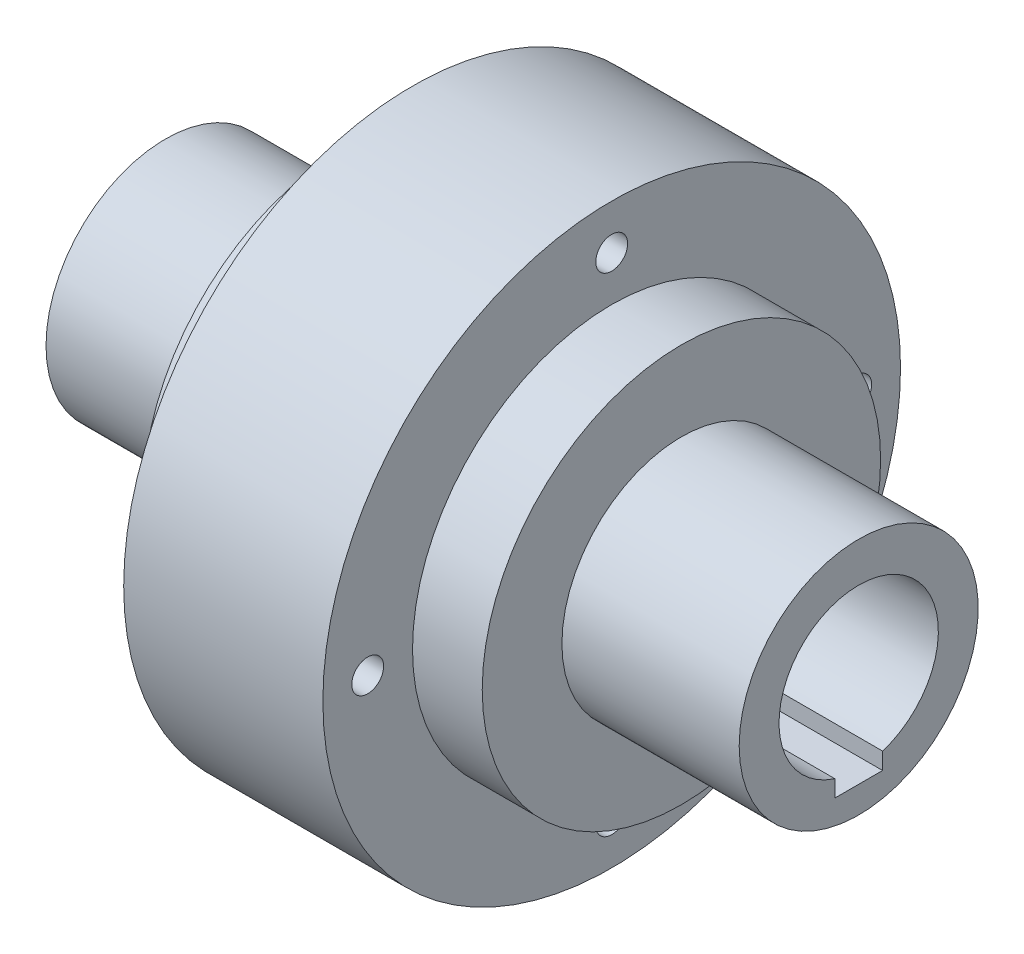
ISO-10303-21;
HEADER;
FILE_DESCRIPTION(('STEP AP214'),'2;1');
FILE_NAME('part.step','',(''),(''),'','','');
FILE_SCHEMA(('AUTOMOTIVE_DESIGN { 1 0 10303 214 1 1 1 1 }'));
ENDSEC;
DATA;
#1=APPLICATION_CONTEXT('core data for automotive mechanical design processes');
#2=APPLICATION_PROTOCOL_DEFINITION('international standard','automotive_design',2000,#1);
#3=PRODUCT_CONTEXT('',#1,'mechanical');
#4=PRODUCT('Part','Part','',(#3));
#5=PRODUCT_RELATED_PRODUCT_CATEGORY('part','',(#4));
#6=PRODUCT_DEFINITION_FORMATION('','',#4);
#7=PRODUCT_DEFINITION_CONTEXT('part definition',#1,'design');
#8=PRODUCT_DEFINITION('design','',#6,#7);
#9=PRODUCT_DEFINITION_SHAPE('','',#8);
#10=(LENGTH_UNIT() NAMED_UNIT(*) SI_UNIT(.MILLI.,.METRE.));
#11=(NAMED_UNIT(*) PLANE_ANGLE_UNIT() SI_UNIT($,.RADIAN.));
#12=(NAMED_UNIT(*) SI_UNIT($,.STERADIAN.) SOLID_ANGLE_UNIT());
#13=UNCERTAINTY_MEASURE_WITH_UNIT(LENGTH_MEASURE(1.E-05),#10,'distance_accuracy_value','');
#14=(GEOMETRIC_REPRESENTATION_CONTEXT(3) GLOBAL_UNCERTAINTY_ASSIGNED_CONTEXT((#13)) GLOBAL_UNIT_ASSIGNED_CONTEXT((#10,
#11,#12)) REPRESENTATION_CONTEXT('',''));
#15=CARTESIAN_POINT('',(0.,0.,0.));
#16=DIRECTION('',(0.,0.,1.));
#17=DIRECTION('',(1.,0.,0.));
#18=AXIS2_PLACEMENT_3D('',#15,#16,#17);
#19=CARTESIAN_POINT('',(-87.,6.41559696012426E-13,-61.25));
#20=DIRECTION('',(1.,0.,0.));
#21=DIRECTION('',(0.,-1.,0.));
#22=AXIS2_PLACEMENT_3D('',#19,#20,#21);
#23=CYLINDRICAL_SURFACE('',#22,4.);
#24=CARTESIAN_POINT('',(25.,6.41559696012426E-13,-61.25));
#25=DIRECTION('',(1.,0.,0.));
#26=DIRECTION('',(0.,-1.,0.));
#27=AXIS2_PLACEMENT_3D('',#24,#25,#26);
#28=CIRCLE('',#27,4.);
#29=CARTESIAN_POINT('',(25.,-3.99999999999936,-61.25));
#30=VERTEX_POINT('',#29);
#31=EDGE_CURVE('E281',#30,#30,#28,.T.);
#32=ORIENTED_EDGE('',*,*,#31,.T.);
#33=EDGE_LOOP('',(#32));
#34=FACE_BOUND('',#33,.T.);
#35=CARTESIAN_POINT('',(-25.,6.41559696012426E-13,-61.25));
#36=DIRECTION('',(1.,0.,0.));
#37=DIRECTION('',(0.,-1.,0.));
#38=AXIS2_PLACEMENT_3D('',#35,#36,#37);
#39=CIRCLE('',#38,4.);
#40=CARTESIAN_POINT('',(-25.,-3.99999999999936,-61.25));
#41=VERTEX_POINT('',#40);
#42=EDGE_CURVE('E47',#41,#41,#39,.T.);
#43=ORIENTED_EDGE('',*,*,#42,.F.);
#44=EDGE_LOOP('',(#43));
#45=FACE_BOUND('',#44,.T.);
#46=ADVANCED_FACE('F39',(#34,#45),#23,.F.);
#47=CARTESIAN_POINT('',(-87.,-61.25,0.));
#48=DIRECTION('',(1.,0.,0.));
#49=DIRECTION('',(0.,0.,1.));
#50=AXIS2_PLACEMENT_3D('',#47,#48,#49);
#51=CYLINDRICAL_SURFACE('',#50,4.);
#52=CARTESIAN_POINT('',(25.,-61.25,0.));
#53=DIRECTION('',(1.,0.,0.));
#54=DIRECTION('',(0.,0.,1.));
#55=AXIS2_PLACEMENT_3D('',#52,#53,#54);
#56=CIRCLE('',#55,4.);
#57=CARTESIAN_POINT('',(25.,-61.25,4.));
#58=VERTEX_POINT('',#57);
#59=EDGE_CURVE('E273',#58,#58,#56,.T.);
#60=ORIENTED_EDGE('',*,*,#59,.T.);
#61=EDGE_LOOP('',(#60));
#62=FACE_BOUND('',#61,.T.);
#63=CARTESIAN_POINT('',(-25.,-61.25,0.));
#64=DIRECTION('',(1.,0.,0.));
#65=DIRECTION('',(0.,0.,1.));
#66=AXIS2_PLACEMENT_3D('',#63,#64,#65);
#67=CIRCLE('',#66,4.);
#68=CARTESIAN_POINT('',(-25.,-61.25,4.));
#69=VERTEX_POINT('',#68);
#70=EDGE_CURVE('E277',#69,#69,#67,.T.);
#71=ORIENTED_EDGE('',*,*,#70,.F.);
#72=EDGE_LOOP('',(#71));
#73=FACE_BOUND('',#72,.T.);
#74=ADVANCED_FACE('F292',(#62,#73),#51,.F.);
#75=CARTESIAN_POINT('',(-87.,-2.13853232004142E-13,61.25));
#76=DIRECTION('',(1.,0.,0.));
#77=DIRECTION('',(0.,1.,0.));
#78=AXIS2_PLACEMENT_3D('',#75,#76,#77);
#79=CYLINDRICAL_SURFACE('',#78,4.);
#80=CARTESIAN_POINT('',(25.,-2.13853232004142E-13,61.25));
#81=DIRECTION('',(1.,0.,0.));
#82=DIRECTION('',(0.,1.,0.));
#83=AXIS2_PLACEMENT_3D('',#80,#81,#82);
#84=CIRCLE('',#83,4.);
#85=CARTESIAN_POINT('',(25.,3.99999999999979,61.25));
#86=VERTEX_POINT('',#85);
#87=EDGE_CURVE('E262',#86,#86,#84,.T.);
#88=ORIENTED_EDGE('',*,*,#87,.T.);
#89=EDGE_LOOP('',(#88));
#90=FACE_BOUND('',#89,.T.);
#91=CARTESIAN_POINT('',(-25.,-2.13853232004142E-13,61.25));
#92=DIRECTION('',(1.,0.,0.));
#93=DIRECTION('',(0.,1.,0.));
#94=AXIS2_PLACEMENT_3D('',#91,#92,#93);
#95=CIRCLE('',#94,4.);
#96=CARTESIAN_POINT('',(-25.,3.99999999999979,61.25));
#97=VERTEX_POINT('',#96);
#98=EDGE_CURVE('E269',#97,#97,#95,.T.);
#99=ORIENTED_EDGE('',*,*,#98,.F.);
#100=EDGE_LOOP('',(#99));
#101=FACE_BOUND('',#100,.T.);
#102=ADVANCED_FACE('F297',(#90,#101),#79,.F.);
#103=CARTESIAN_POINT('',(-171.104100946372,0.,0.));
#104=DIRECTION('',(-1.,0.,0.));
#105=DIRECTION('',(0.,0.,1.));
#106=AXIS2_PLACEMENT_3D('',#103,#104,#105);
#107=CYLINDRICAL_SURFACE('',#106,20.);
#108=CARTESIAN_POINT('',(-87.,0.,0.));
#109=DIRECTION('',(-1.,0.,0.));
#110=DIRECTION('',(0.,0.,1.));
#111=AXIS2_PLACEMENT_3D('',#108,#109,#110);
#112=CIRCLE('',#111,20.);
#113=CARTESIAN_POINT('',(-87.,-19.0787840283389,6.));
#114=VERTEX_POINT('',#113);
#115=CARTESIAN_POINT('',(-87.,-19.0787840283389,-6.));
#116=VERTEX_POINT('',#115);
#117=EDGE_CURVE('E184',#114,#116,#112,.T.);
#118=ORIENTED_EDGE('',*,*,#117,.T.);
#119=DIRECTION('',(-1.,0.,0.));
#120=VECTOR('',#119,1.);
#121=CARTESIAN_POINT('',(-171.104100946372,-19.0787840283389,-6.));
#122=LINE('',#121,#120);
#123=CARTESIAN_POINT('',(-5.,-19.0787840283389,-6.));
#124=VERTEX_POINT('',#123);
#125=EDGE_CURVE('E175',#116,#124,#122,.F.);
#126=ORIENTED_EDGE('',*,*,#125,.T.);
#127=CARTESIAN_POINT('',(-5.,0.,0.));
#128=DIRECTION('',(-1.,0.,0.));
#129=DIRECTION('',(0.,0.,1.));
#130=AXIS2_PLACEMENT_3D('',#127,#128,#129);
#131=CIRCLE('',#130,20.);
#132=CARTESIAN_POINT('',(-5.,-19.0787840283389,6.));
#133=VERTEX_POINT('',#132);
#134=EDGE_CURVE('E258',#133,#124,#131,.T.);
#135=ORIENTED_EDGE('',*,*,#134,.F.);
#136=DIRECTION('',(-1.,0.,0.));
#137=VECTOR('',#136,1.);
#138=CARTESIAN_POINT('',(-171.104100946372,-19.0787840283389,6.));
#139=LINE('',#138,#137);
#140=EDGE_CURVE('E162',#133,#114,#139,.T.);
#141=ORIENTED_EDGE('',*,*,#140,.T.);
#142=EDGE_LOOP('',(#118,#126,#135,#141));
#143=FACE_BOUND('',#142,.T.);
#144=ADVANCED_FACE('F369',(#143),#107,.F.);
#145=CARTESIAN_POINT('',(-5.00000000000001,20.,0.));
#146=DIRECTION('',(-1.,0.,0.));
#147=DIRECTION('',(0.,0.,1.));
#148=AXIS2_PLACEMENT_3D('',#145,#146,#147);
#149=PLANE('',#148);
#150=ORIENTED_EDGE('',*,*,#134,.T.);
#151=DIRECTION('',(0.,-1.,0.));
#152=VECTOR('',#151,1.);
#153=CARTESIAN_POINT('',(-5.00000000000001,20.,-5.99999999999999));
#154=LINE('',#153,#152);
#155=CARTESIAN_POINT('',(-5.,-23.3,-6.));
#156=VERTEX_POINT('',#155);
#157=EDGE_CURVE('E171',#124,#156,#154,.T.);
#158=ORIENTED_EDGE('',*,*,#157,.T.);
#159=DIRECTION('',(0.,0.,1.));
#160=VECTOR('',#159,1.);
#161=CARTESIAN_POINT('',(-5.00000000000001,-23.3,0.));
#162=LINE('',#161,#160);
#163=CARTESIAN_POINT('',(-5.,-23.3,6.));
#164=VERTEX_POINT('',#163);
#165=EDGE_CURVE('E146',#156,#164,#162,.T.);
#166=ORIENTED_EDGE('',*,*,#165,.T.);
#167=DIRECTION('',(0.,1.,0.));
#168=VECTOR('',#167,1.);
#169=CARTESIAN_POINT('',(-5.00000000000001,20.,5.99999999999999));
#170=LINE('',#169,#168);
#171=EDGE_CURVE('E158',#164,#133,#170,.T.);
#172=ORIENTED_EDGE('',*,*,#171,.T.);
#173=EDGE_LOOP('',(#150,#158,#166,#172));
#174=FACE_BOUND('',#173,.T.);
#175=CARTESIAN_POINT('',(-5.,0.,0.));
#176=DIRECTION('',(-1.,0.,0.));
#177=DIRECTION('',(0.,0.,1.));
#178=AXIS2_PLACEMENT_3D('',#175,#176,#177);
#179=CIRCLE('',#178,30.);
#180=CARTESIAN_POINT('',(-5.,0.,30.));
#181=VERTEX_POINT('',#180);
#182=EDGE_CURVE('E254',#181,#181,#179,.T.);
#183=ORIENTED_EDGE('',*,*,#182,.F.);
#184=EDGE_LOOP('',(#183));
#185=FACE_BOUND('',#184,.T.);
#186=ADVANCED_FACE('F365',(#174,#185),#149,.F.);
#187=CARTESIAN_POINT('',(-171.104100946372,0.,0.));
#188=DIRECTION('',(-1.,0.,0.));
#189=DIRECTION('',(0.,0.,1.));
#190=AXIS2_PLACEMENT_3D('',#187,#188,#189);
#191=CYLINDRICAL_SURFACE('',#190,30.);
#192=CARTESIAN_POINT('',(-41.5,0.,0.));
#193=DIRECTION('',(-1.,0.,0.));
#194=DIRECTION('',(0.,0.,1.));
#195=AXIS2_PLACEMENT_3D('',#192,#193,#194);
#196=CIRCLE('',#195,30.);
#197=CARTESIAN_POINT('',(-41.5,0.,30.));
#198=VERTEX_POINT('',#197);
#199=EDGE_CURVE('E250',#198,#198,#196,.T.);
#200=ORIENTED_EDGE('',*,*,#199,.F.);
#201=EDGE_LOOP('',(#200));
#202=FACE_BOUND('',#201,.T.);
#203=ORIENTED_EDGE('',*,*,#182,.T.);
#204=EDGE_LOOP('',(#203));
#205=FACE_BOUND('',#204,.T.);
#206=ADVANCED_FACE('F361',(#202,#205),#191,.T.);
#207=CARTESIAN_POINT('',(-41.5,30.,0.));
#208=DIRECTION('',(-1.,0.,0.));
#209=DIRECTION('',(0.,0.,1.));
#210=AXIS2_PLACEMENT_3D('',#207,#208,#209);
#211=PLANE('',#210);
#212=CARTESIAN_POINT('',(-41.5,0.,0.));
#213=DIRECTION('',(-1.,0.,0.));
#214=DIRECTION('',(0.,0.,1.));
#215=AXIS2_PLACEMENT_3D('',#212,#213,#214);
#216=CIRCLE('',#215,40.0162050477217);
#217=CARTESIAN_POINT('',(-41.5,0.,40.0162050477217));
#218=VERTEX_POINT('',#217);
#219=EDGE_CURVE('E246',#218,#218,#216,.T.);
#220=ORIENTED_EDGE('',*,*,#219,.F.);
#221=EDGE_LOOP('',(#220));
#222=FACE_BOUND('',#221,.T.);
#223=ORIENTED_EDGE('',*,*,#199,.T.);
#224=EDGE_LOOP('',(#223));
#225=FACE_BOUND('',#224,.T.);
#226=ADVANCED_FACE('F357',(#222,#225),#211,.F.);
#227=CARTESIAN_POINT('',(-171.104100946372,0.,0.));
#228=DIRECTION('',(-1.,0.,0.));
#229=DIRECTION('',(0.,0.,1.));
#230=AXIS2_PLACEMENT_3D('',#227,#228,#229);
#231=CYLINDRICAL_SURFACE('',#230,40.0162050477217);
#232=CARTESIAN_POINT('',(41.5,0.,0.));
#233=DIRECTION('',(-1.,0.,0.));
#234=DIRECTION('',(0.,0.,1.));
#235=AXIS2_PLACEMENT_3D('',#232,#233,#234);
#236=CIRCLE('',#235,40.0162050477217);
#237=CARTESIAN_POINT('',(41.5,0.,40.0162050477217));
#238=VERTEX_POINT('',#237);
#239=EDGE_CURVE('E242',#238,#238,#236,.T.);
#240=ORIENTED_EDGE('',*,*,#239,.F.);
#241=EDGE_LOOP('',(#240));
#242=FACE_BOUND('',#241,.T.);
#243=ORIENTED_EDGE('',*,*,#219,.T.);
#244=EDGE_LOOP('',(#243));
#245=FACE_BOUND('',#244,.T.);
#246=ADVANCED_FACE('F353',(#242,#245),#231,.F.);
#247=CARTESIAN_POINT('',(41.5,30.,0.));
#248=DIRECTION('',(1.,0.,0.));
#249=DIRECTION('',(0.,0.,-1.));
#250=AXIS2_PLACEMENT_3D('',#247,#248,#249);
#251=PLANE('',#250);
#252=CARTESIAN_POINT('',(41.5,0.,0.));
#253=DIRECTION('',(-1.,0.,0.));
#254=DIRECTION('',(0.,0.,1.));
#255=AXIS2_PLACEMENT_3D('',#252,#253,#254);
#256=CIRCLE('',#255,30.);
#257=CARTESIAN_POINT('',(41.5,0.,30.));
#258=VERTEX_POINT('',#257);
#259=EDGE_CURVE('E238',#258,#258,#256,.T.);
#260=ORIENTED_EDGE('',*,*,#259,.F.);
#261=EDGE_LOOP('',(#260));
#262=FACE_BOUND('',#261,.T.);
#263=ORIENTED_EDGE('',*,*,#239,.T.);
#264=EDGE_LOOP('',(#263));
#265=FACE_BOUND('',#264,.T.);
#266=ADVANCED_FACE('F349',(#262,#265),#251,.F.);
#267=CARTESIAN_POINT('',(-171.104100946372,0.,0.));
#268=DIRECTION('',(-1.,0.,0.));
#269=DIRECTION('',(0.,0.,1.));
#270=AXIS2_PLACEMENT_3D('',#267,#268,#269);
#271=CYLINDRICAL_SURFACE('',#270,30.);
#272=CARTESIAN_POINT('',(5.,0.,0.));
#273=DIRECTION('',(-1.,0.,0.));
#274=DIRECTION('',(0.,0.,1.));
#275=AXIS2_PLACEMENT_3D('',#272,#273,#274);
#276=CIRCLE('',#275,30.);
#277=CARTESIAN_POINT('',(5.,0.,30.));
#278=VERTEX_POINT('',#277);
#279=EDGE_CURVE('E234',#278,#278,#276,.T.);
#280=ORIENTED_EDGE('',*,*,#279,.F.);
#281=EDGE_LOOP('',(#280));
#282=FACE_BOUND('',#281,.T.);
#283=ORIENTED_EDGE('',*,*,#259,.T.);
#284=EDGE_LOOP('',(#283));
#285=FACE_BOUND('',#284,.T.);
#286=ADVANCED_FACE('F345',(#282,#285),#271,.T.);
#287=CARTESIAN_POINT('',(5.00000000000002,20.,0.));
#288=DIRECTION('',(1.,0.,0.));
#289=DIRECTION('',(0.,0.,-1.));
#290=AXIS2_PLACEMENT_3D('',#287,#288,#289);
#291=PLANE('',#290);
#292=DIRECTION('',(0.,0.,-1.));
#293=VECTOR('',#292,1.);
#294=CARTESIAN_POINT('',(5.00000000000002,-23.3,0.));
#295=LINE('',#294,#293);
#296=CARTESIAN_POINT('',(5.00000000000002,-23.3,6.));
#297=VERTEX_POINT('',#296);
#298=CARTESIAN_POINT('',(5.00000000000002,-23.3,-6.));
#299=VERTEX_POINT('',#298);
#300=EDGE_CURVE('E142',#297,#299,#295,.T.);
#301=ORIENTED_EDGE('',*,*,#300,.T.);
#302=DIRECTION('',(0.,1.,0.));
#303=VECTOR('',#302,1.);
#304=CARTESIAN_POINT('',(5.00000000000002,20.,-5.99999999999999));
#305=LINE('',#304,#303);
#306=CARTESIAN_POINT('',(5.,-19.0787840283389,-6.));
#307=VERTEX_POINT('',#306);
#308=EDGE_CURVE('E112',#299,#307,#305,.T.);
#309=ORIENTED_EDGE('',*,*,#308,.T.);
#310=CARTESIAN_POINT('',(5.,0.,0.));
#311=DIRECTION('',(-1.,0.,0.));
#312=DIRECTION('',(0.,0.,1.));
#313=AXIS2_PLACEMENT_3D('',#310,#311,#312);
#314=CIRCLE('',#313,20.);
#315=CARTESIAN_POINT('',(5.,-19.0787840283389,6.));
#316=VERTEX_POINT('',#315);
#317=EDGE_CURVE('E230',#316,#307,#314,.T.);
#318=ORIENTED_EDGE('',*,*,#317,.F.);
#319=DIRECTION('',(0.,-1.,0.));
#320=VECTOR('',#319,1.);
#321=CARTESIAN_POINT('',(5.00000000000002,20.,5.99999999999999));
#322=LINE('',#321,#320);
#323=EDGE_CURVE('E154',#316,#297,#322,.T.);
#324=ORIENTED_EDGE('',*,*,#323,.T.);
#325=EDGE_LOOP('',(#301,#309,#318,#324));
#326=FACE_BOUND('',#325,.T.);
#327=ORIENTED_EDGE('',*,*,#279,.T.);
#328=EDGE_LOOP('',(#327));
#329=FACE_BOUND('',#328,.T.);
#330=ADVANCED_FACE('F339',(#326,#329),#291,.F.);
#331=CARTESIAN_POINT('',(-171.104100946372,0.,0.));
#332=DIRECTION('',(-1.,0.,0.));
#333=DIRECTION('',(0.,0.,1.));
#334=AXIS2_PLACEMENT_3D('',#331,#332,#333);
#335=CYLINDRICAL_SURFACE('',#334,20.);
#336=ORIENTED_EDGE('',*,*,#317,.T.);
#337=DIRECTION('',(-1.,0.,0.));
#338=VECTOR('',#337,1.);
#339=CARTESIAN_POINT('',(-171.104100946372,-19.0787840283389,-6.));
#340=LINE('',#339,#338);
#341=CARTESIAN_POINT('',(87.,-19.0787840283389,-6.));
#342=VERTEX_POINT('',#341);
#343=EDGE_CURVE('E166',#307,#342,#340,.F.);
#344=ORIENTED_EDGE('',*,*,#343,.T.);
#345=CARTESIAN_POINT('',(87.,0.,0.));
#346=DIRECTION('',(-1.,0.,0.));
#347=DIRECTION('',(0.,0.,1.));
#348=AXIS2_PLACEMENT_3D('',#345,#346,#347);
#349=CIRCLE('',#348,20.);
#350=CARTESIAN_POINT('',(87.,-19.0787840283389,6.));
#351=VERTEX_POINT('',#350);
#352=EDGE_CURVE('E129',#351,#342,#349,.T.);
#353=ORIENTED_EDGE('',*,*,#352,.F.);
#354=DIRECTION('',(-1.,0.,0.));
#355=VECTOR('',#354,1.);
#356=CARTESIAN_POINT('',(-171.104100946372,-19.0787840283389,6.));
#357=LINE('',#356,#355);
#358=EDGE_CURVE('E150',#351,#316,#357,.T.);
#359=ORIENTED_EDGE('',*,*,#358,.T.);
#360=EDGE_LOOP('',(#336,#344,#353,#359));
#361=FACE_BOUND('',#360,.T.);
#362=ADVANCED_FACE('F334',(#361),#335,.F.);
#363=CARTESIAN_POINT('',(87.,20.,0.));
#364=DIRECTION('',(-1.,0.,0.));
#365=DIRECTION('',(0.,0.,1.));
#366=AXIS2_PLACEMENT_3D('',#363,#364,#365);
#367=PLANE('',#366);
#368=ORIENTED_EDGE('',*,*,#352,.T.);
#369=DIRECTION('',(0.,-1.,0.));
#370=VECTOR('',#369,1.);
#371=CARTESIAN_POINT('',(87.,0.,-6.));
#372=LINE('',#371,#370);
#373=CARTESIAN_POINT('',(87.,-23.3,-6.));
#374=VERTEX_POINT('',#373);
#375=EDGE_CURVE('E109',#342,#374,#372,.T.);
#376=ORIENTED_EDGE('',*,*,#375,.T.);
#377=DIRECTION('',(0.,0.,1.));
#378=VECTOR('',#377,1.);
#379=CARTESIAN_POINT('',(87.,-23.3,-6.));
#380=LINE('',#379,#378);
#381=CARTESIAN_POINT('',(87.,-23.3,6.));
#382=VERTEX_POINT('',#381);
#383=EDGE_CURVE('E119',#374,#382,#380,.T.);
#384=ORIENTED_EDGE('',*,*,#383,.T.);
#385=DIRECTION('',(0.,1.,0.));
#386=VECTOR('',#385,1.);
#387=CARTESIAN_POINT('',(87.,0.,6.));
#388=LINE('',#387,#386);
#389=EDGE_CURVE('E54',#382,#351,#388,.T.);
#390=ORIENTED_EDGE('',*,*,#389,.T.);
#391=EDGE_LOOP('',(#368,#376,#384,#390));
#392=FACE_BOUND('',#391,.T.);
#393=CARTESIAN_POINT('',(87.,0.,0.));
#394=DIRECTION('',(-1.,0.,0.));
#395=DIRECTION('',(0.,0.,1.));
#396=AXIS2_PLACEMENT_3D('',#393,#394,#395);
#397=CIRCLE('',#396,30.);
#398=CARTESIAN_POINT('',(87.,0.,30.));
#399=VERTEX_POINT('',#398);
#400=EDGE_CURVE('E224',#399,#399,#397,.T.);
#401=ORIENTED_EDGE('',*,*,#400,.F.);
#402=EDGE_LOOP('',(#401));
#403=FACE_BOUND('',#402,.T.);
#404=ADVANCED_FACE('F126',(#392,#403),#367,.F.);
#405=CARTESIAN_POINT('',(-171.104100946372,0.,0.));
#406=DIRECTION('',(-1.,0.,0.));
#407=DIRECTION('',(0.,0.,1.));
#408=AXIS2_PLACEMENT_3D('',#405,#406,#407);
#409=CYLINDRICAL_SURFACE('',#408,30.);
#410=CARTESIAN_POINT('',(42.5,0.,0.));
#411=DIRECTION('',(-1.,0.,0.));
#412=DIRECTION('',(0.,0.,1.));
#413=AXIS2_PLACEMENT_3D('',#410,#411,#412);
#414=CIRCLE('',#413,30.);
#415=CARTESIAN_POINT('',(42.5,0.,30.));
#416=VERTEX_POINT('',#415);
#417=EDGE_CURVE('E220',#416,#416,#414,.T.);
#418=ORIENTED_EDGE('',*,*,#417,.F.);
#419=EDGE_LOOP('',(#418));
#420=FACE_BOUND('',#419,.T.);
#421=ORIENTED_EDGE('',*,*,#400,.T.);
#422=EDGE_LOOP('',(#421));
#423=FACE_BOUND('',#422,.T.);
#424=ADVANCED_FACE('F325',(#420,#423),#409,.T.);
#425=CARTESIAN_POINT('',(42.5,50.,0.));
#426=DIRECTION('',(-1.,0.,0.));
#427=DIRECTION('',(0.,0.,1.));
#428=AXIS2_PLACEMENT_3D('',#425,#426,#427);
#429=PLANE('',#428);
#430=CARTESIAN_POINT('',(42.5,0.,0.));
#431=DIRECTION('',(-1.,0.,0.));
#432=DIRECTION('',(0.,0.,1.));
#433=AXIS2_PLACEMENT_3D('',#430,#431,#432);
#434=CIRCLE('',#433,50.);
#435=CARTESIAN_POINT('',(42.5,0.,50.));
#436=VERTEX_POINT('',#435);
#437=EDGE_CURVE('E216',#436,#436,#434,.T.);
#438=ORIENTED_EDGE('',*,*,#437,.F.);
#439=EDGE_LOOP('',(#438));
#440=FACE_BOUND('',#439,.T.);
#441=ORIENTED_EDGE('',*,*,#417,.T.);
#442=EDGE_LOOP('',(#441));
#443=FACE_BOUND('',#442,.T.);
#444=ADVANCED_FACE('F319',(#440,#443),#429,.F.);
#445=CARTESIAN_POINT('',(-171.104100946372,0.,0.));
#446=DIRECTION('',(-1.,0.,0.));
#447=DIRECTION('',(0.,0.,1.));
#448=AXIS2_PLACEMENT_3D('',#445,#446,#447);
#449=CYLINDRICAL_SURFACE('',#448,50.);
#450=CARTESIAN_POINT('',(25.,0.,0.));
#451=DIRECTION('',(-1.,0.,0.));
#452=DIRECTION('',(0.,0.,1.));
#453=AXIS2_PLACEMENT_3D('',#450,#451,#452);
#454=CIRCLE('',#453,50.);
#455=CARTESIAN_POINT('',(25.,0.,50.));
#456=VERTEX_POINT('',#455);
#457=EDGE_CURVE('E212',#456,#456,#454,.T.);
#458=ORIENTED_EDGE('',*,*,#457,.F.);
#459=EDGE_LOOP('',(#458));
#460=FACE_BOUND('',#459,.T.);
#461=ORIENTED_EDGE('',*,*,#437,.T.);
#462=EDGE_LOOP('',(#461));
#463=FACE_BOUND('',#462,.T.);
#464=ADVANCED_FACE('F305',(#460,#463),#449,.T.);
#465=CARTESIAN_POINT('',(25.,72.5,0.));
#466=DIRECTION('',(-1.,0.,0.));
#467=DIRECTION('',(0.,0.,1.));
#468=AXIS2_PLACEMENT_3D('',#465,#466,#467);
#469=PLANE('',#468);
#470=ORIENTED_EDGE('',*,*,#31,.F.);
#471=EDGE_LOOP('',(#470));
#472=FACE_BOUND('',#471,.T.);
#473=ORIENTED_EDGE('',*,*,#59,.F.);
#474=EDGE_LOOP('',(#473));
#475=FACE_BOUND('',#474,.T.);
#476=ORIENTED_EDGE('',*,*,#87,.F.);
#477=EDGE_LOOP('',(#476));
#478=FACE_BOUND('',#477,.T.);
#479=CARTESIAN_POINT('',(25.,61.25,0.));
#480=DIRECTION('',(1.,0.,0.));
#481=DIRECTION('',(0.,0.,-1.));
#482=AXIS2_PLACEMENT_3D('',#479,#480,#481);
#483=CIRCLE('',#482,4.);
#484=CARTESIAN_POINT('',(25.,61.25,-4.));
#485=VERTEX_POINT('',#484);
#486=EDGE_CURVE('E179',#485,#485,#483,.T.);
#487=ORIENTED_EDGE('',*,*,#486,.F.);
#488=EDGE_LOOP('',(#487));
#489=FACE_BOUND('',#488,.T.);
#490=CARTESIAN_POINT('',(25.,0.,0.));
#491=DIRECTION('',(-1.,0.,0.));
#492=DIRECTION('',(0.,0.,1.));
#493=AXIS2_PLACEMENT_3D('',#490,#491,#492);
#494=CIRCLE('',#493,72.5);
#495=CARTESIAN_POINT('',(25.,0.,72.5));
#496=VERTEX_POINT('',#495);
#497=EDGE_CURVE('E208',#496,#496,#494,.T.);
#498=ORIENTED_EDGE('',*,*,#497,.F.);
#499=EDGE_LOOP('',(#498));
#500=FACE_BOUND('',#499,.T.);
#501=ORIENTED_EDGE('',*,*,#457,.T.);
#502=EDGE_LOOP('',(#501));
#503=FACE_BOUND('',#502,.T.);
#504=ADVANCED_FACE('F301',(#472,#475,#478,#489,#500,#503),#469,.F.);
#505=CARTESIAN_POINT('',(-171.104100946372,0.,0.));
#506=DIRECTION('',(-1.,0.,0.));
#507=DIRECTION('',(0.,0.,1.));
#508=AXIS2_PLACEMENT_3D('',#505,#506,#507);
#509=CYLINDRICAL_SURFACE('',#508,72.5);
#510=CARTESIAN_POINT('',(-25.,0.,0.));
#511=DIRECTION('',(-1.,0.,0.));
#512=DIRECTION('',(0.,0.,1.));
#513=AXIS2_PLACEMENT_3D('',#510,#511,#512);
#514=CIRCLE('',#513,72.5);
#515=CARTESIAN_POINT('',(-25.,0.,72.5));
#516=VERTEX_POINT('',#515);
#517=EDGE_CURVE('E204',#516,#516,#514,.T.);
#518=ORIENTED_EDGE('',*,*,#517,.F.);
#519=EDGE_LOOP('',(#518));
#520=FACE_BOUND('',#519,.T.);
#521=ORIENTED_EDGE('',*,*,#497,.T.);
#522=EDGE_LOOP('',(#521));
#523=FACE_BOUND('',#522,.T.);
#524=ADVANCED_FACE('F304',(#520,#523),#509,.T.);
#525=CARTESIAN_POINT('',(-25.,72.5,0.));
#526=DIRECTION('',(1.,0.,0.));
#527=DIRECTION('',(0.,0.,-1.));
#528=AXIS2_PLACEMENT_3D('',#525,#526,#527);
#529=PLANE('',#528);
#530=ORIENTED_EDGE('',*,*,#42,.T.);
#531=EDGE_LOOP('',(#530));
#532=FACE_BOUND('',#531,.T.);
#533=ORIENTED_EDGE('',*,*,#70,.T.);
#534=EDGE_LOOP('',(#533));
#535=FACE_BOUND('',#534,.T.);
#536=ORIENTED_EDGE('',*,*,#98,.T.);
#537=EDGE_LOOP('',(#536));
#538=FACE_BOUND('',#537,.T.);
#539=CARTESIAN_POINT('',(-25.,61.25,0.));
#540=DIRECTION('',(1.,0.,0.));
#541=DIRECTION('',(0.,0.,-1.));
#542=AXIS2_PLACEMENT_3D('',#539,#540,#541);
#543=CIRCLE('',#542,4.);
#544=CARTESIAN_POINT('',(-25.,61.25,-4.));
#545=VERTEX_POINT('',#544);
#546=EDGE_CURVE('E183',#545,#545,#543,.T.);
#547=ORIENTED_EDGE('',*,*,#546,.T.);
#548=EDGE_LOOP('',(#547));
#549=FACE_BOUND('',#548,.T.);
#550=CARTESIAN_POINT('',(-25.,0.,0.));
#551=DIRECTION('',(-1.,0.,0.));
#552=DIRECTION('',(0.,0.,1.));
#553=AXIS2_PLACEMENT_3D('',#550,#551,#552);
#554=CIRCLE('',#553,50.);
#555=CARTESIAN_POINT('',(-25.,0.,50.));
#556=VERTEX_POINT('',#555);
#557=EDGE_CURVE('E200',#556,#556,#554,.T.);
#558=ORIENTED_EDGE('',*,*,#557,.F.);
#559=EDGE_LOOP('',(#558));
#560=FACE_BOUND('',#559,.T.);
#561=ORIENTED_EDGE('',*,*,#517,.T.);
#562=EDGE_LOOP('',(#561));
#563=FACE_BOUND('',#562,.T.);
#564=ADVANCED_FACE('F288',(#532,#535,#538,#549,#560,#563),#529,.F.);
#565=CARTESIAN_POINT('',(-171.104100946372,0.,0.));
#566=DIRECTION('',(-1.,0.,0.));
#567=DIRECTION('',(0.,0.,1.));
#568=AXIS2_PLACEMENT_3D('',#565,#566,#567);
#569=CYLINDRICAL_SURFACE('',#568,50.);
#570=CARTESIAN_POINT('',(-42.5,0.,0.));
#571=DIRECTION('',(-1.,0.,0.));
#572=DIRECTION('',(0.,0.,1.));
#573=AXIS2_PLACEMENT_3D('',#570,#571,#572);
#574=CIRCLE('',#573,50.);
#575=CARTESIAN_POINT('',(-42.5,0.,50.));
#576=VERTEX_POINT('',#575);
#577=EDGE_CURVE('E196',#576,#576,#574,.T.);
#578=ORIENTED_EDGE('',*,*,#577,.F.);
#579=EDGE_LOOP('',(#578));
#580=FACE_BOUND('',#579,.T.);
#581=ORIENTED_EDGE('',*,*,#557,.T.);
#582=EDGE_LOOP('',(#581));
#583=FACE_BOUND('',#582,.T.);
#584=ADVANCED_FACE('F383',(#580,#583),#569,.T.);
#585=CARTESIAN_POINT('',(-42.5,50.,0.));
#586=DIRECTION('',(1.,0.,0.));
#587=DIRECTION('',(0.,0.,-1.));
#588=AXIS2_PLACEMENT_3D('',#585,#586,#587);
#589=PLANE('',#588);
#590=CARTESIAN_POINT('',(-42.5,0.,0.));
#591=DIRECTION('',(-1.,0.,0.));
#592=DIRECTION('',(0.,0.,1.));
#593=AXIS2_PLACEMENT_3D('',#590,#591,#592);
#594=CIRCLE('',#593,30.);
#595=CARTESIAN_POINT('',(-42.5,0.,30.));
#596=VERTEX_POINT('',#595);
#597=EDGE_CURVE('E192',#596,#596,#594,.T.);
#598=ORIENTED_EDGE('',*,*,#597,.F.);
#599=EDGE_LOOP('',(#598));
#600=FACE_BOUND('',#599,.T.);
#601=ORIENTED_EDGE('',*,*,#577,.T.);
#602=EDGE_LOOP('',(#601));
#603=FACE_BOUND('',#602,.T.);
#604=ADVANCED_FACE('F399',(#600,#603),#589,.F.);
#605=CARTESIAN_POINT('',(-171.104100946372,0.,0.));
#606=DIRECTION('',(-1.,0.,0.));
#607=DIRECTION('',(0.,0.,1.));
#608=AXIS2_PLACEMENT_3D('',#605,#606,#607);
#609=CYLINDRICAL_SURFACE('',#608,30.);
#610=CARTESIAN_POINT('',(-87.,0.,0.));
#611=DIRECTION('',(-1.,0.,0.));
#612=DIRECTION('',(0.,0.,1.));
#613=AXIS2_PLACEMENT_3D('',#610,#611,#612);
#614=CIRCLE('',#613,30.);
#615=CARTESIAN_POINT('',(-87.,0.,30.));
#616=VERTEX_POINT('',#615);
#617=EDGE_CURVE('E188',#616,#616,#614,.T.);
#618=ORIENTED_EDGE('',*,*,#617,.F.);
#619=EDGE_LOOP('',(#618));
#620=FACE_BOUND('',#619,.T.);
#621=ORIENTED_EDGE('',*,*,#597,.T.);
#622=EDGE_LOOP('',(#621));
#623=FACE_BOUND('',#622,.T.);
#624=ADVANCED_FACE('F403',(#620,#623),#609,.T.);
#625=CARTESIAN_POINT('',(-87.,20.,0.));
#626=DIRECTION('',(1.,0.,0.));
#627=DIRECTION('',(0.,0.,-1.));
#628=AXIS2_PLACEMENT_3D('',#625,#626,#627);
#629=PLANE('',#628);
#630=DIRECTION('',(0.,0.,1.));
#631=VECTOR('',#630,1.);
#632=CARTESIAN_POINT('',(-87.,-23.3,-6.));
#633=LINE('',#632,#631);
#634=CARTESIAN_POINT('',(-87.,-23.3,-6.));
#635=VERTEX_POINT('',#634);
#636=CARTESIAN_POINT('',(-87.,-23.3,6.));
#637=VERTEX_POINT('',#636);
#638=EDGE_CURVE('E134',#635,#637,#633,.T.);
#639=ORIENTED_EDGE('',*,*,#638,.F.);
#640=DIRECTION('',(0.,1.,0.));
#641=VECTOR('',#640,1.);
#642=CARTESIAN_POINT('',(-87.,20.,-5.99999999999999));
#643=LINE('',#642,#641);
#644=EDGE_CURVE('E11',#635,#116,#643,.T.);
#645=ORIENTED_EDGE('',*,*,#644,.T.);
#646=ORIENTED_EDGE('',*,*,#117,.F.);
#647=DIRECTION('',(0.,1.,0.));
#648=VECTOR('',#647,1.);
#649=CARTESIAN_POINT('',(-87.,0.,6.));
#650=LINE('',#649,#648);
#651=EDGE_CURVE('E131',#637,#114,#650,.T.);
#652=ORIENTED_EDGE('',*,*,#651,.F.);
#653=EDGE_LOOP('',(#639,#645,#646,#652));
#654=FACE_BOUND('',#653,.T.);
#655=ORIENTED_EDGE('',*,*,#617,.T.);
#656=EDGE_LOOP('',(#655));
#657=FACE_BOUND('',#656,.T.);
#658=ADVANCED_FACE('F407',(#654,#657),#629,.F.);
#659=CARTESIAN_POINT('',(-87.,61.25,0.));
#660=DIRECTION('',(1.,0.,0.));
#661=DIRECTION('',(0.,0.,-1.));
#662=AXIS2_PLACEMENT_3D('',#659,#660,#661);
#663=CYLINDRICAL_SURFACE('',#662,4.);
#664=ORIENTED_EDGE('',*,*,#486,.T.);
#665=EDGE_LOOP('',(#664));
#666=FACE_BOUND('',#665,.T.);
#667=ORIENTED_EDGE('',*,*,#546,.F.);
#668=EDGE_LOOP('',(#667));
#669=FACE_BOUND('',#668,.T.);
#670=ADVANCED_FACE('F411',(#666,#669),#663,.F.);
#671=CARTESIAN_POINT('',(87.,-23.3,-6.));
#672=DIRECTION('',(0.,-1.,0.));
#673=DIRECTION('',(0.,0.,-1.));
#674=AXIS2_PLACEMENT_3D('',#671,#672,#673);
#675=PLANE('',#674);
#676=DIRECTION('',(-1.,0.,0.));
#677=VECTOR('',#676,1.);
#678=CARTESIAN_POINT('',(87.,-23.3,-6.));
#679=LINE('',#678,#677);
#680=EDGE_CURVE('E62',#156,#635,#679,.T.);
#681=ORIENTED_EDGE('',*,*,#680,.T.);
#682=ORIENTED_EDGE('',*,*,#638,.T.);
#683=DIRECTION('',(-1.,0.,0.));
#684=VECTOR('',#683,1.);
#685=CARTESIAN_POINT('',(87.,-23.3,6.));
#686=LINE('',#685,#684);
#687=EDGE_CURVE('E116',#164,#637,#686,.T.);
#688=ORIENTED_EDGE('',*,*,#687,.F.);
#689=ORIENTED_EDGE('',*,*,#165,.F.);
#690=EDGE_LOOP('',(#681,#682,#688,#689));
#691=FACE_BOUND('',#690,.T.);
#692=ADVANCED_FACE('F415',(#691),#675,.F.);
#693=CARTESIAN_POINT('',(87.,0.,6.));
#694=DIRECTION('',(0.,0.,1.));
#695=DIRECTION('',(0.,-1.,0.));
#696=AXIS2_PLACEMENT_3D('',#693,#694,#695);
#697=PLANE('',#696);
#698=ORIENTED_EDGE('',*,*,#171,.F.);
#699=ORIENTED_EDGE('',*,*,#687,.T.);
#700=ORIENTED_EDGE('',*,*,#651,.T.);
#701=ORIENTED_EDGE('',*,*,#140,.F.);
#702=EDGE_LOOP('',(#698,#699,#700,#701));
#703=FACE_BOUND('',#702,.T.);
#704=ADVANCED_FACE('F420',(#703),#697,.F.);
#705=CARTESIAN_POINT('',(87.,0.,-6.));
#706=DIRECTION('',(0.,0.,-1.));
#707=DIRECTION('',(0.,1.,0.));
#708=AXIS2_PLACEMENT_3D('',#705,#706,#707);
#709=PLANE('',#708);
#710=ORIENTED_EDGE('',*,*,#644,.F.);
#711=ORIENTED_EDGE('',*,*,#680,.F.);
#712=ORIENTED_EDGE('',*,*,#157,.F.);
#713=ORIENTED_EDGE('',*,*,#125,.F.);
#714=EDGE_LOOP('',(#710,#711,#712,#713));
#715=FACE_BOUND('',#714,.T.);
#716=ADVANCED_FACE('F417',(#715),#709,.F.);
#717=EDGE_CURVE('E105',#374,#299,#679,.T.);
#718=ORIENTED_EDGE('',*,*,#717,.F.);
#719=ORIENTED_EDGE('',*,*,#375,.F.);
#720=ORIENTED_EDGE('',*,*,#343,.F.);
#721=ORIENTED_EDGE('',*,*,#308,.F.);
#722=EDGE_LOOP('',(#718,#719,#720,#721));
#723=FACE_BOUND('',#722,.T.);
#724=ADVANCED_FACE('F107',(#723),#709,.F.);
#725=ORIENTED_EDGE('',*,*,#358,.F.);
#726=ORIENTED_EDGE('',*,*,#389,.F.);
#727=EDGE_CURVE('E121',#382,#297,#686,.T.);
#728=ORIENTED_EDGE('',*,*,#727,.T.);
#729=ORIENTED_EDGE('',*,*,#323,.F.);
#730=EDGE_LOOP('',(#725,#726,#728,#729));
#731=FACE_BOUND('',#730,.T.);
#732=ADVANCED_FACE('F426',(#731),#697,.F.);
#733=ORIENTED_EDGE('',*,*,#727,.F.);
#734=ORIENTED_EDGE('',*,*,#383,.F.);
#735=ORIENTED_EDGE('',*,*,#717,.T.);
#736=ORIENTED_EDGE('',*,*,#300,.F.);
#737=EDGE_LOOP('',(#733,#734,#735,#736));
#738=FACE_BOUND('',#737,.T.);
#739=ADVANCED_FACE('F120',(#738),#675,.F.);
#740=CLOSED_SHELL('',(#46,#74,#102,#144,#186,#206,#226,#246,#266,#286,#330,#362,#404,#424,#444,
#464,#504,#524,#564,#584,#604,#624,#658,#670,#692,#704,#716,#724,#732,#739));
#741=MANIFOLD_SOLID_BREP('B2',#740);
#742=ADVANCED_BREP_SHAPE_REPRESENTATION('',(#18,#741),#14);
#743=SHAPE_DEFINITION_REPRESENTATION(#9,#742);
ENDSEC;
END-ISO-10303-21;
